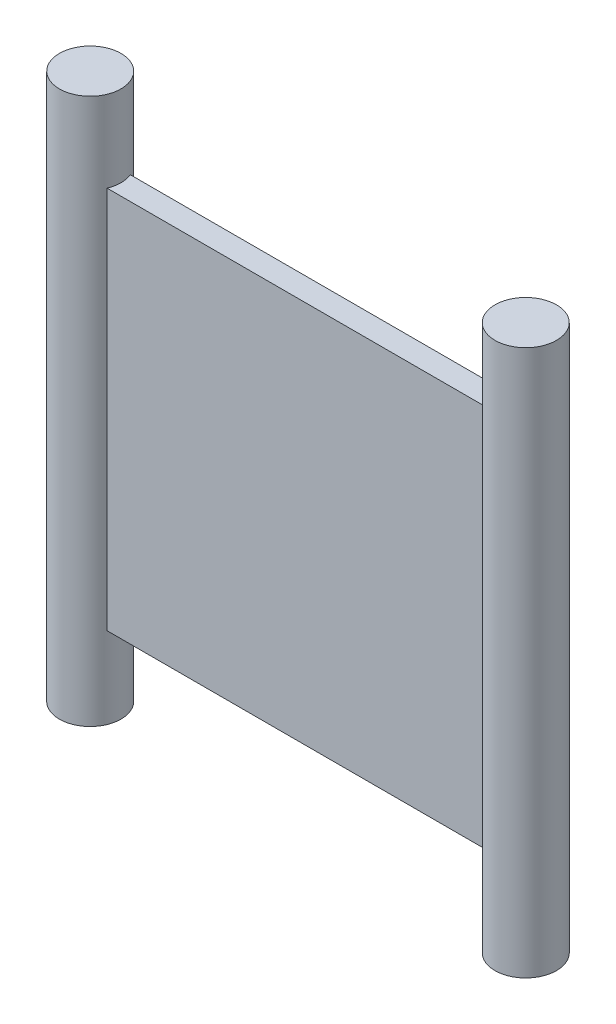
ISO-10303-21;
HEADER;
FILE_DESCRIPTION(('STEP AP214'),'2;1');
FILE_NAME('part.step','',(''),(''),'','','');
FILE_SCHEMA(('AUTOMOTIVE_DESIGN { 1 0 10303 214 1 1 1 1 }'));
ENDSEC;
DATA;
#1=APPLICATION_CONTEXT('core data for automotive mechanical design processes');
#2=APPLICATION_PROTOCOL_DEFINITION('international standard','automotive_design',2000,#1);
#3=PRODUCT_CONTEXT('',#1,'mechanical');
#4=PRODUCT('Part','Part','',(#3));
#5=PRODUCT_RELATED_PRODUCT_CATEGORY('part','',(#4));
#6=PRODUCT_DEFINITION_FORMATION('','',#4);
#7=PRODUCT_DEFINITION_CONTEXT('part definition',#1,'design');
#8=PRODUCT_DEFINITION('design','',#6,#7);
#9=PRODUCT_DEFINITION_SHAPE('','',#8);
#10=(LENGTH_UNIT() NAMED_UNIT(*) SI_UNIT(.MILLI.,.METRE.));
#11=(NAMED_UNIT(*) PLANE_ANGLE_UNIT() SI_UNIT($,.RADIAN.));
#12=(NAMED_UNIT(*) SI_UNIT($,.STERADIAN.) SOLID_ANGLE_UNIT());
#13=UNCERTAINTY_MEASURE_WITH_UNIT(LENGTH_MEASURE(1.E-05),#10,'distance_accuracy_value','');
#14=(GEOMETRIC_REPRESENTATION_CONTEXT(3) GLOBAL_UNCERTAINTY_ASSIGNED_CONTEXT((#13)) GLOBAL_UNIT_ASSIGNED_CONTEXT((#10,
#11,#12)) REPRESENTATION_CONTEXT('',''));
#15=CARTESIAN_POINT('',(0.,0.,0.));
#16=DIRECTION('',(0.,0.,1.));
#17=DIRECTION('',(1.,0.,0.));
#18=AXIS2_PLACEMENT_3D('',#15,#16,#17);
#19=CARTESIAN_POINT('',(9.375,16.5,0.499999999999999));
#20=DIRECTION('',(0.,0.,-1.));
#21=DIRECTION('',(-1.,0.,0.));
#22=AXIS2_PLACEMENT_3D('',#19,#20,#21);
#23=PLANE('',#22);
#24=DIRECTION('',(0.,-1.,0.));
#25=VECTOR('',#24,1.);
#26=CARTESIAN_POINT('',(8.1479608808192,20.,0.499999999999999));
#27=LINE('',#26,#25);
#28=CARTESIAN_POINT('',(8.1479608808192,16.5,0.499999999999999));
#29=VERTEX_POINT('',#28);
#30=CARTESIAN_POINT('',(8.1479608808192,0.,0.499999999999999));
#31=VERTEX_POINT('',#30);
#32=EDGE_CURVE('E53',#29,#31,#27,.T.);
#33=ORIENTED_EDGE('',*,*,#32,.F.);
#34=DIRECTION('',(1.,0.,0.));
#35=VECTOR('',#34,1.);
#36=CARTESIAN_POINT('',(9.375,16.5,0.499999999999999));
#37=LINE('',#36,#35);
#38=CARTESIAN_POINT('',(-8.14796088081919,16.5,0.500000000000001));
#39=VERTEX_POINT('',#38);
#40=EDGE_CURVE('E90',#39,#29,#37,.T.);
#41=ORIENTED_EDGE('',*,*,#40,.F.);
#42=DIRECTION('',(0.,-1.,0.));
#43=VECTOR('',#42,1.);
#44=CARTESIAN_POINT('',(-8.14796088081919,20.,0.500000000000001));
#45=LINE('',#44,#43);
#46=CARTESIAN_POINT('',(-8.14796088081919,0.,0.500000000000001));
#47=VERTEX_POINT('',#46);
#48=EDGE_CURVE('E103',#47,#39,#45,.F.);
#49=ORIENTED_EDGE('',*,*,#48,.F.);
#50=DIRECTION('',(1.,0.,0.));
#51=VECTOR('',#50,1.);
#52=CARTESIAN_POINT('',(9.375,0.,0.499999999999999));
#53=LINE('',#52,#51);
#54=EDGE_CURVE('E91',#47,#31,#53,.T.);
#55=ORIENTED_EDGE('',*,*,#54,.T.);
#56=EDGE_LOOP('',(#33,#41,#49,#55));
#57=FACE_BOUND('',#56,.T.);
#58=ADVANCED_FACE('F39',(#57),#23,.F.);
#59=CARTESIAN_POINT('',(9.375,16.5,-0.500000000000001));
#60=DIRECTION('',(0.,0.,1.));
#61=DIRECTION('',(1.,0.,0.));
#62=AXIS2_PLACEMENT_3D('',#59,#60,#61);
#63=PLANE('',#62);
#64=DIRECTION('',(0.,-1.,0.));
#65=VECTOR('',#64,1.);
#66=CARTESIAN_POINT('',(8.1479608808192,20.,-0.500000000000001));
#67=LINE('',#66,#65);
#68=CARTESIAN_POINT('',(8.1479608808192,0.,-0.500000000000001));
#69=VERTEX_POINT('',#68);
#70=CARTESIAN_POINT('',(8.1479608808192,16.5,-0.500000000000001));
#71=VERTEX_POINT('',#70);
#72=EDGE_CURVE('E78',#69,#71,#67,.F.);
#73=ORIENTED_EDGE('',*,*,#72,.F.);
#74=DIRECTION('',(-1.,0.,0.));
#75=VECTOR('',#74,1.);
#76=CARTESIAN_POINT('',(9.375,0.,-0.500000000000001));
#77=LINE('',#76,#75);
#78=CARTESIAN_POINT('',(-8.14796088081919,0.,-0.499999999999999));
#79=VERTEX_POINT('',#78);
#80=EDGE_CURVE('E60',#69,#79,#77,.T.);
#81=ORIENTED_EDGE('',*,*,#80,.T.);
#82=DIRECTION('',(0.,-1.,0.));
#83=VECTOR('',#82,1.);
#84=CARTESIAN_POINT('',(-8.14796088081919,20.,-0.499999999999999));
#85=LINE('',#84,#83);
#86=CARTESIAN_POINT('',(-8.14796088081919,16.5,-0.499999999999999));
#87=VERTEX_POINT('',#86);
#88=EDGE_CURVE('E105',#87,#79,#85,.T.);
#89=ORIENTED_EDGE('',*,*,#88,.F.);
#90=DIRECTION('',(-1.,0.,0.));
#91=VECTOR('',#90,1.);
#92=CARTESIAN_POINT('',(9.375,16.5,-0.500000000000001));
#93=LINE('',#92,#91);
#94=EDGE_CURVE('E85',#71,#87,#93,.T.);
#95=ORIENTED_EDGE('',*,*,#94,.F.);
#96=EDGE_LOOP('',(#73,#81,#89,#95));
#97=FACE_BOUND('',#96,.T.);
#98=ADVANCED_FACE('F84',(#97),#63,.F.);
#99=CARTESIAN_POINT('',(-9.375,20.,0.));
#100=DIRECTION('',(0.,-1.,0.));
#101=DIRECTION('',(0.,0.,-1.));
#102=AXIS2_PLACEMENT_3D('',#99,#100,#101);
#103=CYLINDRICAL_SURFACE('',#102,1.325);
#104=CARTESIAN_POINT('',(-9.375,20.,0.));
#105=DIRECTION('',(0.,1.,0.));
#106=DIRECTION('',(0.,0.,1.));
#107=AXIS2_PLACEMENT_3D('',#104,#105,#106);
#108=CIRCLE('',#107,1.325);
#109=CARTESIAN_POINT('',(-9.375,20.,1.325));
#110=VERTEX_POINT('',#109);
#111=EDGE_CURVE('E107',#110,#110,#108,.T.);
#112=ORIENTED_EDGE('',*,*,#111,.F.);
#113=EDGE_LOOP('',(#112));
#114=FACE_BOUND('',#113,.T.);
#115=CARTESIAN_POINT('',(-9.375,-3.5,0.));
#116=DIRECTION('',(0.,1.,0.));
#117=DIRECTION('',(0.,0.,1.));
#118=AXIS2_PLACEMENT_3D('',#115,#116,#117);
#119=CIRCLE('',#118,1.325);
#120=CARTESIAN_POINT('',(-9.375,-3.5,1.325));
#121=VERTEX_POINT('',#120);
#122=EDGE_CURVE('E108',#121,#121,#119,.T.);
#123=ORIENTED_EDGE('',*,*,#122,.T.);
#124=EDGE_LOOP('',(#123));
#125=FACE_BOUND('',#124,.T.);
#126=ORIENTED_EDGE('',*,*,#48,.T.);
#127=CARTESIAN_POINT('',(-9.375,16.5,0.));
#128=DIRECTION('',(0.,-1.,0.));
#129=DIRECTION('',(0.,0.,-1.));
#130=AXIS2_PLACEMENT_3D('',#127,#128,#129);
#131=CIRCLE('',#130,1.325);
#132=EDGE_CURVE('E95',#39,#87,#131,.F.);
#133=ORIENTED_EDGE('',*,*,#132,.T.);
#134=ORIENTED_EDGE('',*,*,#88,.T.);
#135=CARTESIAN_POINT('',(-9.375,0.,0.));
#136=DIRECTION('',(0.,-1.,0.));
#137=DIRECTION('',(0.,0.,-1.));
#138=AXIS2_PLACEMENT_3D('',#135,#136,#137);
#139=CIRCLE('',#138,1.325);
#140=EDGE_CURVE('E46',#47,#79,#139,.F.);
#141=ORIENTED_EDGE('',*,*,#140,.F.);
#142=EDGE_LOOP('',(#126,#133,#134,#141));
#143=FACE_BOUND('',#142,.T.);
#144=ADVANCED_FACE('F138',(#114,#125,#143),#103,.T.);
#145=CARTESIAN_POINT('',(-9.375,20.,0.));
#146=DIRECTION('',(0.,1.,0.));
#147=DIRECTION('',(0.,0.,1.));
#148=AXIS2_PLACEMENT_3D('',#145,#146,#147);
#149=PLANE('',#148);
#150=ORIENTED_EDGE('',*,*,#111,.T.);
#151=EDGE_LOOP('',(#150));
#152=FACE_BOUND('',#151,.T.);
#153=ADVANCED_FACE('F144',(#152),#149,.T.);
#154=CARTESIAN_POINT('',(-9.375,-3.5,0.));
#155=DIRECTION('',(0.,1.,0.));
#156=DIRECTION('',(0.,0.,1.));
#157=AXIS2_PLACEMENT_3D('',#154,#155,#156);
#158=PLANE('',#157);
#159=ORIENTED_EDGE('',*,*,#122,.F.);
#160=EDGE_LOOP('',(#159));
#161=FACE_BOUND('',#160,.T.);
#162=ADVANCED_FACE('F150',(#161),#158,.F.);
#163=CARTESIAN_POINT('',(0.,16.5,0.));
#164=DIRECTION('',(0.,-1.,0.));
#165=DIRECTION('',(0.,0.,-1.));
#166=AXIS2_PLACEMENT_3D('',#163,#164,#165);
#167=PLANE('',#166);
#168=CARTESIAN_POINT('',(9.375,16.5,0.));
#169=DIRECTION('',(0.,-1.,0.));
#170=DIRECTION('',(0.,0.,-1.));
#171=AXIS2_PLACEMENT_3D('',#168,#169,#170);
#172=CIRCLE('',#171,1.325);
#173=EDGE_CURVE('E111',#71,#29,#172,.F.);
#174=ORIENTED_EDGE('',*,*,#173,.F.);
#175=ORIENTED_EDGE('',*,*,#94,.T.);
#176=ORIENTED_EDGE('',*,*,#132,.F.);
#177=ORIENTED_EDGE('',*,*,#40,.T.);
#178=EDGE_LOOP('',(#174,#175,#176,#177));
#179=FACE_BOUND('',#178,.T.);
#180=ADVANCED_FACE('F141',(#179),#167,.F.);
#181=CARTESIAN_POINT('',(0.,0.,0.));
#182=DIRECTION('',(0.,-1.,0.));
#183=DIRECTION('',(0.,0.,-1.));
#184=AXIS2_PLACEMENT_3D('',#181,#182,#183);
#185=PLANE('',#184);
#186=ORIENTED_EDGE('',*,*,#80,.F.);
#187=CARTESIAN_POINT('',(9.375,0.,0.));
#188=DIRECTION('',(0.,-1.,0.));
#189=DIRECTION('',(0.,0.,-1.));
#190=AXIS2_PLACEMENT_3D('',#187,#188,#189);
#191=CIRCLE('',#190,1.325);
#192=EDGE_CURVE('E11',#69,#31,#191,.F.);
#193=ORIENTED_EDGE('',*,*,#192,.T.);
#194=ORIENTED_EDGE('',*,*,#54,.F.);
#195=ORIENTED_EDGE('',*,*,#140,.T.);
#196=EDGE_LOOP('',(#186,#193,#194,#195));
#197=FACE_BOUND('',#196,.T.);
#198=ADVANCED_FACE('F89',(#197),#185,.T.);
#199=CARTESIAN_POINT('',(9.375,20.,0.));
#200=DIRECTION('',(0.,-1.,0.));
#201=DIRECTION('',(0.,0.,-1.));
#202=AXIS2_PLACEMENT_3D('',#199,#200,#201);
#203=CYLINDRICAL_SURFACE('',#202,1.325);
#204=CARTESIAN_POINT('',(9.375,20.,0.));
#205=DIRECTION('',(0.,1.,0.));
#206=DIRECTION('',(0.,0.,1.));
#207=AXIS2_PLACEMENT_3D('',#204,#205,#206);
#208=CIRCLE('',#207,1.325);
#209=CARTESIAN_POINT('',(9.375,20.,1.325));
#210=VERTEX_POINT('',#209);
#211=EDGE_CURVE('E116',#210,#210,#208,.T.);
#212=ORIENTED_EDGE('',*,*,#211,.F.);
#213=EDGE_LOOP('',(#212));
#214=FACE_BOUND('',#213,.T.);
#215=CARTESIAN_POINT('',(9.375,-3.5,0.));
#216=DIRECTION('',(0.,1.,0.));
#217=DIRECTION('',(0.,0.,1.));
#218=AXIS2_PLACEMENT_3D('',#215,#216,#217);
#219=CIRCLE('',#218,1.325);
#220=CARTESIAN_POINT('',(9.375,-3.5,1.325));
#221=VERTEX_POINT('',#220);
#222=EDGE_CURVE('E86',#221,#221,#219,.T.);
#223=ORIENTED_EDGE('',*,*,#222,.T.);
#224=EDGE_LOOP('',(#223));
#225=FACE_BOUND('',#224,.T.);
#226=ORIENTED_EDGE('',*,*,#72,.T.);
#227=ORIENTED_EDGE('',*,*,#173,.T.);
#228=ORIENTED_EDGE('',*,*,#32,.T.);
#229=ORIENTED_EDGE('',*,*,#192,.F.);
#230=EDGE_LOOP('',(#226,#227,#228,#229));
#231=FACE_BOUND('',#230,.T.);
#232=ADVANCED_FACE('F77',(#214,#225,#231),#203,.T.);
#233=CARTESIAN_POINT('',(9.375,20.,0.));
#234=DIRECTION('',(0.,1.,0.));
#235=DIRECTION('',(0.,0.,1.));
#236=AXIS2_PLACEMENT_3D('',#233,#234,#235);
#237=PLANE('',#236);
#238=ORIENTED_EDGE('',*,*,#211,.T.);
#239=EDGE_LOOP('',(#238));
#240=FACE_BOUND('',#239,.T.);
#241=ADVANCED_FACE('F125',(#240),#237,.T.);
#242=CARTESIAN_POINT('',(9.375,-3.5,0.));
#243=DIRECTION('',(0.,1.,0.));
#244=DIRECTION('',(0.,0.,1.));
#245=AXIS2_PLACEMENT_3D('',#242,#243,#244);
#246=PLANE('',#245);
#247=ORIENTED_EDGE('',*,*,#222,.F.);
#248=EDGE_LOOP('',(#247));
#249=FACE_BOUND('',#248,.T.);
#250=ADVANCED_FACE('F123',(#249),#246,.F.);
#251=CLOSED_SHELL('',(#58,#98,#144,#153,#162,#180,#198,#232,#241,#250));
#252=MANIFOLD_SOLID_BREP('B2',#251);
#253=ADVANCED_BREP_SHAPE_REPRESENTATION('',(#18,#252),#14);
#254=SHAPE_DEFINITION_REPRESENTATION(#9,#253);
ENDSEC;
END-ISO-10303-21;
